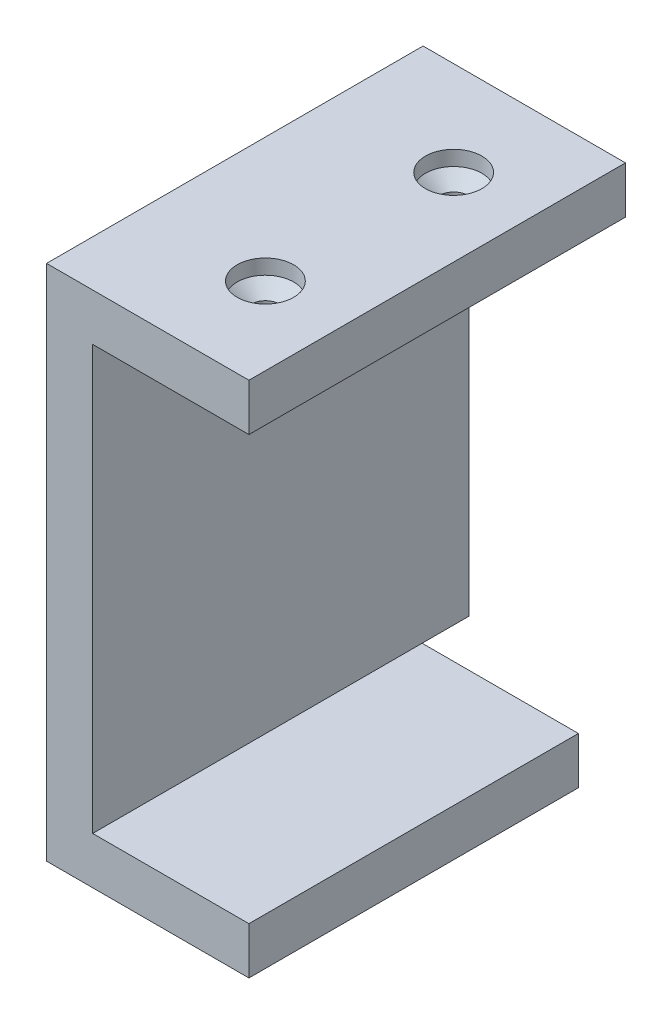
ISO-10303-21;
HEADER;
FILE_DESCRIPTION(('STEP AP214'),'2;1');
FILE_NAME('part.step','',(''),(''),'','','');
FILE_SCHEMA(('AUTOMOTIVE_DESIGN { 1 0 10303 214 1 1 1 1 }'));
ENDSEC;
DATA;
#1=APPLICATION_CONTEXT('core data for automotive mechanical design processes');
#2=APPLICATION_PROTOCOL_DEFINITION('international standard','automotive_design',2000,#1);
#3=PRODUCT_CONTEXT('',#1,'mechanical');
#4=PRODUCT('Part','Part','',(#3));
#5=PRODUCT_RELATED_PRODUCT_CATEGORY('part','',(#4));
#6=PRODUCT_DEFINITION_FORMATION('','',#4);
#7=PRODUCT_DEFINITION_CONTEXT('part definition',#1,'design');
#8=PRODUCT_DEFINITION('design','',#6,#7);
#9=PRODUCT_DEFINITION_SHAPE('','',#8);
#10=(LENGTH_UNIT() NAMED_UNIT(*) SI_UNIT(.MILLI.,.METRE.));
#11=(NAMED_UNIT(*) PLANE_ANGLE_UNIT() SI_UNIT($,.RADIAN.));
#12=(NAMED_UNIT(*) SI_UNIT($,.STERADIAN.) SOLID_ANGLE_UNIT());
#13=UNCERTAINTY_MEASURE_WITH_UNIT(LENGTH_MEASURE(1.E-05),#10,'distance_accuracy_value','');
#14=(GEOMETRIC_REPRESENTATION_CONTEXT(3) GLOBAL_UNCERTAINTY_ASSIGNED_CONTEXT((#13)) GLOBAL_UNIT_ASSIGNED_CONTEXT((#10,
#11,#12)) REPRESENTATION_CONTEXT('',''));
#15=CARTESIAN_POINT('',(0.,0.,0.));
#16=DIRECTION('',(0.,0.,1.));
#17=DIRECTION('',(1.,0.,0.));
#18=AXIS2_PLACEMENT_3D('',#15,#16,#17);
#19=CARTESIAN_POINT('',(0.749999999999992,5.,-10.));
#20=DIRECTION('',(0.,-1.,0.));
#21=DIRECTION('',(0.,0.,-1.));
#22=AXIS2_PLACEMENT_3D('',#19,#20,#21);
#23=CYLINDRICAL_SURFACE('',#22,3.);
#24=CARTESIAN_POINT('',(0.749999999999992,5.,-10.));
#25=DIRECTION('',(0.,-1.,0.));
#26=DIRECTION('',(0.,0.,-1.));
#27=AXIS2_PLACEMENT_3D('',#24,#25,#26);
#28=CIRCLE('',#27,3.);
#29=CARTESIAN_POINT('',(0.749999999999992,5.,-13.));
#30=VERTEX_POINT('',#29);
#31=EDGE_CURVE('E262',#30,#30,#28,.T.);
#32=ORIENTED_EDGE('',*,*,#31,.F.);
#33=EDGE_LOOP('',(#32));
#34=FACE_BOUND('',#33,.T.);
#35=CARTESIAN_POINT('',(0.749999999999992,3.41499999999989,-10.));
#36=DIRECTION('',(0.,1.,0.));
#37=DIRECTION('',(0.,0.,1.));
#38=AXIS2_PLACEMENT_3D('',#35,#36,#37);
#39=CIRCLE('',#38,3.);
#40=CARTESIAN_POINT('',(0.749999999999992,3.41499999999989,-7.));
#41=VERTEX_POINT('',#40);
#42=EDGE_CURVE('E11',#41,#41,#39,.T.);
#43=ORIENTED_EDGE('',*,*,#42,.F.);
#44=EDGE_LOOP('',(#43));
#45=FACE_BOUND('',#44,.T.);
#46=ADVANCED_FACE('F39',(#34,#45),#23,.F.);
#47=CARTESIAN_POINT('',(0.749999999999992,5.,10.));
#48=DIRECTION('',(0.,-1.,0.));
#49=DIRECTION('',(0.,0.,-1.));
#50=AXIS2_PLACEMENT_3D('',#47,#48,#49);
#51=CYLINDRICAL_SURFACE('',#50,3.);
#52=CARTESIAN_POINT('',(0.749999999999992,5.,10.));
#53=DIRECTION('',(0.,-1.,0.));
#54=DIRECTION('',(0.,0.,1.));
#55=AXIS2_PLACEMENT_3D('',#52,#53,#54);
#56=CIRCLE('',#55,3.);
#57=CARTESIAN_POINT('',(0.749999999999992,5.,13.));
#58=VERTEX_POINT('',#57);
#59=EDGE_CURVE('E264',#58,#58,#56,.T.);
#60=ORIENTED_EDGE('',*,*,#59,.F.);
#61=EDGE_LOOP('',(#60));
#62=FACE_BOUND('',#61,.T.);
#63=CARTESIAN_POINT('',(0.749999999999992,3.41499999999989,10.));
#64=DIRECTION('',(0.,1.,0.));
#65=DIRECTION('',(0.,0.,1.));
#66=AXIS2_PLACEMENT_3D('',#63,#64,#65);
#67=CIRCLE('',#66,3.);
#68=CARTESIAN_POINT('',(0.749999999999992,3.41499999999989,13.));
#69=VERTEX_POINT('',#68);
#70=EDGE_CURVE('E47',#69,#69,#67,.T.);
#71=ORIENTED_EDGE('',*,*,#70,.F.);
#72=EDGE_LOOP('',(#71));
#73=FACE_BOUND('',#72,.T.);
#74=ADVANCED_FACE('F186',(#62,#73),#51,.F.);
#75=CARTESIAN_POINT('',(-7.5,5.,20.));
#76=DIRECTION('',(0.,0.,-1.));
#77=DIRECTION('',(-1.,0.,0.));
#78=AXIS2_PLACEMENT_3D('',#75,#76,#77);
#79=PLANE('',#78);
#80=DIRECTION('',(0.,-1.,0.));
#81=VECTOR('',#80,1.);
#82=CARTESIAN_POINT('',(-12.5,5.,20.));
#83=LINE('',#82,#81);
#84=CARTESIAN_POINT('',(-12.5,5.,20.));
#85=VERTEX_POINT('',#84);
#86=CARTESIAN_POINT('',(-12.5,-50.,20.));
#87=VERTEX_POINT('',#86);
#88=EDGE_CURVE('E166',#85,#87,#83,.T.);
#89=ORIENTED_EDGE('',*,*,#88,.T.);
#90=DIRECTION('',(-1.,0.,0.));
#91=VECTOR('',#90,1.);
#92=CARTESIAN_POINT('',(-12.5,-50.,20.));
#93=LINE('',#92,#91);
#94=CARTESIAN_POINT('',(9.,-50.,20.));
#95=VERTEX_POINT('',#94);
#96=EDGE_CURVE('E132',#95,#87,#93,.T.);
#97=ORIENTED_EDGE('',*,*,#96,.F.);
#98=DIRECTION('',(0.,1.,0.));
#99=VECTOR('',#98,1.);
#100=CARTESIAN_POINT('',(9.,-50.,20.));
#101=LINE('',#100,#99);
#102=CARTESIAN_POINT('',(9.,-45.,20.));
#103=VERTEX_POINT('',#102);
#104=EDGE_CURVE('E143',#95,#103,#101,.T.);
#105=ORIENTED_EDGE('',*,*,#104,.T.);
#106=DIRECTION('',(-1.,0.,0.));
#107=VECTOR('',#106,1.);
#108=CARTESIAN_POINT('',(-12.5,-45.,20.));
#109=LINE('',#108,#107);
#110=CARTESIAN_POINT('',(-7.6,-45.,20.));
#111=VERTEX_POINT('',#110);
#112=EDGE_CURVE('E135',#103,#111,#109,.T.);
#113=ORIENTED_EDGE('',*,*,#112,.T.);
#114=DIRECTION('',(0.,1.,0.));
#115=VECTOR('',#114,1.);
#116=CARTESIAN_POINT('',(-7.6,-45.,20.));
#117=LINE('',#116,#115);
#118=CARTESIAN_POINT('',(-7.6,0.,20.));
#119=VERTEX_POINT('',#118);
#120=EDGE_CURVE('E153',#111,#119,#117,.T.);
#121=ORIENTED_EDGE('',*,*,#120,.T.);
#122=DIRECTION('',(1.,0.,0.));
#123=VECTOR('',#122,1.);
#124=CARTESIAN_POINT('',(-7.5,0.,20.));
#125=LINE('',#124,#123);
#126=CARTESIAN_POINT('',(9.,0.,20.));
#127=VERTEX_POINT('',#126);
#128=EDGE_CURVE('E155',#119,#127,#125,.T.);
#129=ORIENTED_EDGE('',*,*,#128,.T.);
#130=DIRECTION('',(0.,-1.,0.));
#131=VECTOR('',#130,1.);
#132=CARTESIAN_POINT('',(9.,5.,20.));
#133=LINE('',#132,#131);
#134=CARTESIAN_POINT('',(9.,5.,20.));
#135=VERTEX_POINT('',#134);
#136=EDGE_CURVE('E179',#135,#127,#133,.T.);
#137=ORIENTED_EDGE('',*,*,#136,.F.);
#138=DIRECTION('',(1.,0.,0.));
#139=VECTOR('',#138,1.);
#140=CARTESIAN_POINT('',(-7.5,5.,20.));
#141=LINE('',#140,#139);
#142=EDGE_CURVE('E157',#85,#135,#141,.T.);
#143=ORIENTED_EDGE('',*,*,#142,.F.);
#144=EDGE_LOOP('',(#89,#97,#105,#113,#121,#129,#137,#143));
#145=FACE_BOUND('',#144,.T.);
#146=ADVANCED_FACE('F41',(#145),#79,.F.);
#147=CARTESIAN_POINT('',(9.,5.,20.));
#148=DIRECTION('',(-1.,0.,0.));
#149=DIRECTION('',(0.,0.,1.));
#150=AXIS2_PLACEMENT_3D('',#147,#148,#149);
#151=PLANE('',#150);
#152=DIRECTION('',(0.,0.,-1.));
#153=VECTOR('',#152,1.);
#154=CARTESIAN_POINT('',(9.,0.,20.));
#155=LINE('',#154,#153);
#156=CARTESIAN_POINT('',(8.99999999999999,0.,-20.));
#157=VERTEX_POINT('',#156);
#158=EDGE_CURVE('E168',#127,#157,#155,.T.);
#159=ORIENTED_EDGE('',*,*,#158,.T.);
#160=DIRECTION('',(0.,-1.,0.));
#161=VECTOR('',#160,1.);
#162=CARTESIAN_POINT('',(8.99999999999999,5.,-20.));
#163=LINE('',#162,#161);
#164=CARTESIAN_POINT('',(8.99999999999999,5.,-20.));
#165=VERTEX_POINT('',#164);
#166=EDGE_CURVE('E176',#165,#157,#163,.T.);
#167=ORIENTED_EDGE('',*,*,#166,.F.);
#168=DIRECTION('',(0.,0.,-1.));
#169=VECTOR('',#168,1.);
#170=CARTESIAN_POINT('',(9.,5.,20.));
#171=LINE('',#170,#169);
#172=EDGE_CURVE('E159',#135,#165,#171,.T.);
#173=ORIENTED_EDGE('',*,*,#172,.F.);
#174=ORIENTED_EDGE('',*,*,#136,.T.);
#175=EDGE_LOOP('',(#159,#167,#173,#174));
#176=FACE_BOUND('',#175,.T.);
#177=ADVANCED_FACE('F195',(#176),#151,.F.);
#178=CARTESIAN_POINT('',(-12.5,5.,-20.));
#179=DIRECTION('',(0.,0.,1.));
#180=DIRECTION('',(1.,0.,0.));
#181=AXIS2_PLACEMENT_3D('',#178,#179,#180);
#182=PLANE('',#181);
#183=DIRECTION('',(-1.,0.,0.));
#184=VECTOR('',#183,1.);
#185=CARTESIAN_POINT('',(-12.5,0.,-20.));
#186=LINE('',#185,#184);
#187=CARTESIAN_POINT('',(-7.6,0.,-20.));
#188=VERTEX_POINT('',#187);
#189=EDGE_CURVE('E160',#157,#188,#186,.T.);
#190=ORIENTED_EDGE('',*,*,#189,.T.);
#191=DIRECTION('',(0.,1.,0.));
#192=VECTOR('',#191,1.);
#193=CARTESIAN_POINT('',(-7.60000000000001,-45.,-20.));
#194=LINE('',#193,#192);
#195=CARTESIAN_POINT('',(-7.60000000000001,-45.,-20.));
#196=VERTEX_POINT('',#195);
#197=EDGE_CURVE('E62',#196,#188,#194,.T.);
#198=ORIENTED_EDGE('',*,*,#197,.F.);
#199=DIRECTION('',(-1.,0.,0.));
#200=VECTOR('',#199,1.);
#201=CARTESIAN_POINT('',(-7.60000000000001,-45.,-20.));
#202=LINE('',#201,#200);
#203=CARTESIAN_POINT('',(-12.5,-45.,-20.));
#204=VERTEX_POINT('',#203);
#205=EDGE_CURVE('E149',#196,#204,#202,.T.);
#206=ORIENTED_EDGE('',*,*,#205,.T.);
#207=DIRECTION('',(0.,-1.,0.));
#208=VECTOR('',#207,1.);
#209=CARTESIAN_POINT('',(-12.5,5.,-20.));
#210=LINE('',#209,#208);
#211=CARTESIAN_POINT('',(-12.5,5.,-20.));
#212=VERTEX_POINT('',#211);
#213=EDGE_CURVE('E174',#212,#204,#210,.T.);
#214=ORIENTED_EDGE('',*,*,#213,.F.);
#215=DIRECTION('',(-1.,0.,0.));
#216=VECTOR('',#215,1.);
#217=CARTESIAN_POINT('',(-7.50000000000001,5.,-20.));
#218=LINE('',#217,#216);
#219=EDGE_CURVE('E162',#165,#212,#218,.T.);
#220=ORIENTED_EDGE('',*,*,#219,.F.);
#221=ORIENTED_EDGE('',*,*,#166,.T.);
#222=EDGE_LOOP('',(#190,#198,#206,#214,#220,#221));
#223=FACE_BOUND('',#222,.T.);
#224=ADVANCED_FACE('F230',(#223),#182,.F.);
#225=CARTESIAN_POINT('',(-12.5,5.,-20.));
#226=DIRECTION('',(1.,0.,0.));
#227=DIRECTION('',(0.,0.,-1.));
#228=AXIS2_PLACEMENT_3D('',#225,#226,#227);
#229=PLANE('',#228);
#230=ORIENTED_EDGE('',*,*,#213,.T.);
#231=DIRECTION('',(0.,0.,1.));
#232=VECTOR('',#231,1.);
#233=CARTESIAN_POINT('',(-12.5,-45.,-20.));
#234=LINE('',#233,#232);
#235=CARTESIAN_POINT('',(-12.5,-45.,-15.));
#236=VERTEX_POINT('',#235);
#237=EDGE_CURVE('E138',#204,#236,#234,.T.);
#238=ORIENTED_EDGE('',*,*,#237,.T.);
#239=DIRECTION('',(0.,1.,0.));
#240=VECTOR('',#239,1.);
#241=CARTESIAN_POINT('',(-12.5,-50.,-15.));
#242=LINE('',#241,#240);
#243=CARTESIAN_POINT('',(-12.5,-50.,-15.));
#244=VERTEX_POINT('',#243);
#245=EDGE_CURVE('E120',#244,#236,#242,.T.);
#246=ORIENTED_EDGE('',*,*,#245,.F.);
#247=DIRECTION('',(0.,0.,-1.));
#248=VECTOR('',#247,1.);
#249=CARTESIAN_POINT('',(-12.5,-50.,-15.));
#250=LINE('',#249,#248);
#251=EDGE_CURVE('E126',#87,#244,#250,.T.);
#252=ORIENTED_EDGE('',*,*,#251,.F.);
#253=ORIENTED_EDGE('',*,*,#88,.F.);
#254=DIRECTION('',(0.,0.,1.));
#255=VECTOR('',#254,1.);
#256=CARTESIAN_POINT('',(-12.5,5.,-20.));
#257=LINE('',#256,#255);
#258=EDGE_CURVE('E164',#212,#85,#257,.T.);
#259=ORIENTED_EDGE('',*,*,#258,.F.);
#260=EDGE_LOOP('',(#230,#238,#246,#252,#253,#259));
#261=FACE_BOUND('',#260,.T.);
#262=ADVANCED_FACE('F137',(#261),#229,.F.);
#263=CARTESIAN_POINT('',(0.,5.,0.));
#264=DIRECTION('',(0.,1.,0.));
#265=DIRECTION('',(0.,0.,1.));
#266=AXIS2_PLACEMENT_3D('',#263,#264,#265);
#267=PLANE('',#266);
#268=ORIENTED_EDGE('',*,*,#31,.T.);
#269=EDGE_LOOP('',(#268));
#270=FACE_BOUND('',#269,.T.);
#271=ORIENTED_EDGE('',*,*,#59,.T.);
#272=EDGE_LOOP('',(#271));
#273=FACE_BOUND('',#272,.T.);
#274=ORIENTED_EDGE('',*,*,#142,.T.);
#275=ORIENTED_EDGE('',*,*,#172,.T.);
#276=ORIENTED_EDGE('',*,*,#219,.T.);
#277=ORIENTED_EDGE('',*,*,#258,.T.);
#278=EDGE_LOOP('',(#274,#275,#276,#277));
#279=FACE_BOUND('',#278,.T.);
#280=ADVANCED_FACE('F222',(#270,#273,#279),#267,.T.);
#281=CARTESIAN_POINT('',(0.,0.,0.));
#282=DIRECTION('',(0.,1.,0.));
#283=DIRECTION('',(0.,0.,1.));
#284=AXIS2_PLACEMENT_3D('',#281,#282,#283);
#285=PLANE('',#284);
#286=ORIENTED_EDGE('',*,*,#128,.F.);
#287=DIRECTION('',(0.,0.,-1.));
#288=VECTOR('',#287,1.);
#289=CARTESIAN_POINT('',(-7.60000000000001,0.,-20.));
#290=LINE('',#289,#288);
#291=EDGE_CURVE('E139',#119,#188,#290,.T.);
#292=ORIENTED_EDGE('',*,*,#291,.T.);
#293=ORIENTED_EDGE('',*,*,#189,.F.);
#294=ORIENTED_EDGE('',*,*,#158,.F.);
#295=EDGE_LOOP('',(#286,#292,#293,#294));
#296=FACE_BOUND('',#295,.T.);
#297=CARTESIAN_POINT('',(0.749999999999992,0.,10.));
#298=DIRECTION('',(0.,1.,0.));
#299=DIRECTION('',(0.,0.,1.));
#300=AXIS2_PLACEMENT_3D('',#297,#298,#299);
#301=CIRCLE('',#300,1.52561463023933);
#302=CARTESIAN_POINT('',(0.749999999999992,0.,11.5256146302393));
#303=VERTEX_POINT('',#302);
#304=EDGE_CURVE('E273',#303,#303,#301,.T.);
#305=ORIENTED_EDGE('',*,*,#304,.T.);
#306=EDGE_LOOP('',(#305));
#307=FACE_BOUND('',#306,.T.);
#308=CARTESIAN_POINT('',(0.749999999999992,0.,-10.));
#309=DIRECTION('',(0.,-1.,0.));
#310=DIRECTION('',(0.,0.,-1.));
#311=AXIS2_PLACEMENT_3D('',#308,#309,#310);
#312=CIRCLE('',#311,1.52561463023933);
#313=CARTESIAN_POINT('',(0.749999999999992,0.,-11.5256146302393));
#314=VERTEX_POINT('',#313);
#315=EDGE_CURVE('E279',#314,#314,#312,.T.);
#316=ORIENTED_EDGE('',*,*,#315,.F.);
#317=EDGE_LOOP('',(#316));
#318=FACE_BOUND('',#317,.T.);
#319=ADVANCED_FACE('F221',(#296,#307,#318),#285,.F.);
#320=CARTESIAN_POINT('',(-7.60000000000001,-45.,-20.));
#321=DIRECTION('',(1.,0.,0.));
#322=DIRECTION('',(0.,0.,-1.));
#323=AXIS2_PLACEMENT_3D('',#320,#321,#322);
#324=PLANE('',#323);
#325=ORIENTED_EDGE('',*,*,#291,.F.);
#326=ORIENTED_EDGE('',*,*,#120,.F.);
#327=DIRECTION('',(0.,0.,-1.));
#328=VECTOR('',#327,1.);
#329=CARTESIAN_POINT('',(-7.60000000000001,-45.,-20.));
#330=LINE('',#329,#328);
#331=CARTESIAN_POINT('',(-7.6,-45.,-15.));
#332=VERTEX_POINT('',#331);
#333=EDGE_CURVE('E147',#111,#332,#330,.T.);
#334=ORIENTED_EDGE('',*,*,#333,.T.);
#335=EDGE_CURVE('E141',#332,#196,#330,.T.);
#336=ORIENTED_EDGE('',*,*,#335,.T.);
#337=ORIENTED_EDGE('',*,*,#197,.T.);
#338=EDGE_LOOP('',(#325,#326,#334,#336,#337));
#339=FACE_BOUND('',#338,.T.);
#340=ADVANCED_FACE('F218',(#339),#324,.T.);
#341=CARTESIAN_POINT('',(0.,-45.,0.));
#342=DIRECTION('',(0.,-1.,0.));
#343=DIRECTION('',(0.,0.,-1.));
#344=AXIS2_PLACEMENT_3D('',#341,#342,#343);
#345=PLANE('',#344);
#346=DIRECTION('',(1.,0.,0.));
#347=VECTOR('',#346,1.);
#348=CARTESIAN_POINT('',(-12.5,-45.,-15.));
#349=LINE('',#348,#347);
#350=EDGE_CURVE('E54',#236,#332,#349,.T.);
#351=ORIENTED_EDGE('',*,*,#350,.F.);
#352=ORIENTED_EDGE('',*,*,#237,.F.);
#353=ORIENTED_EDGE('',*,*,#205,.F.);
#354=ORIENTED_EDGE('',*,*,#335,.F.);
#355=EDGE_LOOP('',(#351,#352,#353,#354));
#356=FACE_BOUND('',#355,.T.);
#357=ADVANCED_FACE('F209',(#356),#345,.T.);
#358=CARTESIAN_POINT('',(0.,-45.,0.));
#359=DIRECTION('',(0.,1.,0.));
#360=DIRECTION('',(0.,0.,1.));
#361=AXIS2_PLACEMENT_3D('',#358,#359,#360);
#362=PLANE('',#361);
#363=ORIENTED_EDGE('',*,*,#333,.F.);
#364=ORIENTED_EDGE('',*,*,#112,.F.);
#365=DIRECTION('',(0.,0.,1.));
#366=VECTOR('',#365,1.);
#367=CARTESIAN_POINT('',(9.,-45.,-15.));
#368=LINE('',#367,#366);
#369=CARTESIAN_POINT('',(9.,-45.,-15.));
#370=VERTEX_POINT('',#369);
#371=EDGE_CURVE('E256',#370,#103,#368,.T.);
#372=ORIENTED_EDGE('',*,*,#371,.F.);
#373=EDGE_CURVE('E253',#332,#370,#349,.T.);
#374=ORIENTED_EDGE('',*,*,#373,.F.);
#375=EDGE_LOOP('',(#363,#364,#372,#374));
#376=FACE_BOUND('',#375,.T.);
#377=ADVANCED_FACE('F206',(#376),#362,.T.);
#378=CARTESIAN_POINT('',(-12.5,-50.,-15.));
#379=DIRECTION('',(0.,0.,1.));
#380=DIRECTION('',(1.,0.,0.));
#381=AXIS2_PLACEMENT_3D('',#378,#379,#380);
#382=PLANE('',#381);
#383=ORIENTED_EDGE('',*,*,#350,.T.);
#384=ORIENTED_EDGE('',*,*,#373,.T.);
#385=DIRECTION('',(0.,1.,0.));
#386=VECTOR('',#385,1.);
#387=CARTESIAN_POINT('',(9.,-50.,-15.));
#388=LINE('',#387,#386);
#389=CARTESIAN_POINT('',(9.,-50.,-15.));
#390=VERTEX_POINT('',#389);
#391=EDGE_CURVE('E122',#390,#370,#388,.T.);
#392=ORIENTED_EDGE('',*,*,#391,.F.);
#393=DIRECTION('',(1.,0.,0.));
#394=VECTOR('',#393,1.);
#395=CARTESIAN_POINT('',(-12.5,-50.,-15.));
#396=LINE('',#395,#394);
#397=EDGE_CURVE('E116',#244,#390,#396,.T.);
#398=ORIENTED_EDGE('',*,*,#397,.F.);
#399=ORIENTED_EDGE('',*,*,#245,.T.);
#400=EDGE_LOOP('',(#383,#384,#392,#398,#399));
#401=FACE_BOUND('',#400,.T.);
#402=ADVANCED_FACE('F118',(#401),#382,.F.);
#403=CARTESIAN_POINT('',(9.,-50.,-15.));
#404=DIRECTION('',(-1.,0.,0.));
#405=DIRECTION('',(0.,0.,1.));
#406=AXIS2_PLACEMENT_3D('',#403,#404,#405);
#407=PLANE('',#406);
#408=ORIENTED_EDGE('',*,*,#371,.T.);
#409=ORIENTED_EDGE('',*,*,#104,.F.);
#410=DIRECTION('',(0.,0.,1.));
#411=VECTOR('',#410,1.);
#412=CARTESIAN_POINT('',(9.,-50.,-15.));
#413=LINE('',#412,#411);
#414=EDGE_CURVE('E125',#390,#95,#413,.T.);
#415=ORIENTED_EDGE('',*,*,#414,.F.);
#416=ORIENTED_EDGE('',*,*,#391,.T.);
#417=EDGE_LOOP('',(#408,#409,#415,#416));
#418=FACE_BOUND('',#417,.T.);
#419=ADVANCED_FACE('F205',(#418),#407,.F.);
#420=CARTESIAN_POINT('',(0.,-50.,0.));
#421=DIRECTION('',(0.,1.,0.));
#422=DIRECTION('',(0.,0.,1.));
#423=AXIS2_PLACEMENT_3D('',#420,#421,#422);
#424=PLANE('',#423);
#425=ORIENTED_EDGE('',*,*,#251,.T.);
#426=ORIENTED_EDGE('',*,*,#397,.T.);
#427=ORIENTED_EDGE('',*,*,#414,.T.);
#428=ORIENTED_EDGE('',*,*,#96,.T.);
#429=EDGE_LOOP('',(#425,#426,#427,#428));
#430=FACE_BOUND('',#429,.T.);
#431=ADVANCED_FACE('F130',(#430),#424,.F.);
#432=CARTESIAN_POINT('',(0.749999999999992,3.415,10.));
#433=DIRECTION('',(0.,1.,0.));
#434=DIRECTION('',(0.,0.,1.));
#435=AXIS2_PLACEMENT_3D('',#432,#433,#434);
#436=CONICAL_SURFACE('',#435,3.00000000000013,0.848171078737155);
#437=CARTESIAN_POINT('',(0.749999999999992,2.11499999999999,10.));
#438=DIRECTION('',(0.,1.,0.));
#439=DIRECTION('',(0.,0.,1.));
#440=AXIS2_PLACEMENT_3D('',#437,#438,#439);
#441=CIRCLE('',#440,1.52561463023933);
#442=CARTESIAN_POINT('',(0.749999999999992,2.11499999999999,11.5256146302393));
#443=VERTEX_POINT('',#442);
#444=EDGE_CURVE('E268',#443,#443,#441,.T.);
#445=ORIENTED_EDGE('',*,*,#444,.F.);
#446=EDGE_LOOP('',(#445));
#447=FACE_BOUND('',#446,.T.);
#448=ORIENTED_EDGE('',*,*,#70,.T.);
#449=EDGE_LOOP('',(#448));
#450=FACE_BOUND('',#449,.T.);
#451=ADVANCED_FACE('F184',(#447,#450),#436,.F.);
#452=CARTESIAN_POINT('',(0.749999999999992,5.,10.));
#453=DIRECTION('',(0.,1.,0.));
#454=DIRECTION('',(0.,0.,1.));
#455=AXIS2_PLACEMENT_3D('',#452,#453,#454);
#456=CYLINDRICAL_SURFACE('',#455,1.52561463023933);
#457=ORIENTED_EDGE('',*,*,#304,.F.);
#458=EDGE_LOOP('',(#457));
#459=FACE_BOUND('',#458,.T.);
#460=ORIENTED_EDGE('',*,*,#444,.T.);
#461=EDGE_LOOP('',(#460));
#462=FACE_BOUND('',#461,.T.);
#463=ADVANCED_FACE('F293',(#459,#462),#456,.F.);
#464=CARTESIAN_POINT('',(0.749999999999992,3.415,-10.));
#465=DIRECTION('',(0.,1.,0.));
#466=DIRECTION('',(0.,0.,-1.));
#467=AXIS2_PLACEMENT_3D('',#464,#465,#466);
#468=CONICAL_SURFACE('',#467,3.00000000000013,0.848171078737155);
#469=CARTESIAN_POINT('',(0.749999999999992,2.11499999999999,-10.));
#470=DIRECTION('',(0.,-1.,0.));
#471=DIRECTION('',(0.,0.,-1.));
#472=AXIS2_PLACEMENT_3D('',#469,#470,#471);
#473=CIRCLE('',#472,1.52561463023933);
#474=CARTESIAN_POINT('',(0.749999999999992,2.11499999999999,-11.5256146302393));
#475=VERTEX_POINT('',#474);
#476=EDGE_CURVE('E276',#475,#475,#473,.T.);
#477=ORIENTED_EDGE('',*,*,#476,.T.);
#478=EDGE_LOOP('',(#477));
#479=FACE_BOUND('',#478,.T.);
#480=ORIENTED_EDGE('',*,*,#42,.T.);
#481=EDGE_LOOP('',(#480));
#482=FACE_BOUND('',#481,.T.);
#483=ADVANCED_FACE('F287',(#479,#482),#468,.F.);
#484=CARTESIAN_POINT('',(0.749999999999992,5.,-10.));
#485=DIRECTION('',(0.,1.,0.));
#486=DIRECTION('',(0.,0.,-1.));
#487=AXIS2_PLACEMENT_3D('',#484,#485,#486);
#488=CYLINDRICAL_SURFACE('',#487,1.52561463023933);
#489=ORIENTED_EDGE('',*,*,#315,.T.);
#490=EDGE_LOOP('',(#489));
#491=FACE_BOUND('',#490,.T.);
#492=ORIENTED_EDGE('',*,*,#476,.F.);
#493=EDGE_LOOP('',(#492));
#494=FACE_BOUND('',#493,.T.);
#495=ADVANCED_FACE('F283',(#491,#494),#488,.F.);
#496=CLOSED_SHELL('',(#46,#74,#146,#177,#224,#262,#280,#319,#340,#357,#377,#402,#419,#431,#451,
#463,#483,#495));
#497=MANIFOLD_SOLID_BREP('B2',#496);
#498=ADVANCED_BREP_SHAPE_REPRESENTATION('',(#18,#497),#14);
#499=SHAPE_DEFINITION_REPRESENTATION(#9,#498);
ENDSEC;
END-ISO-10303-21;
